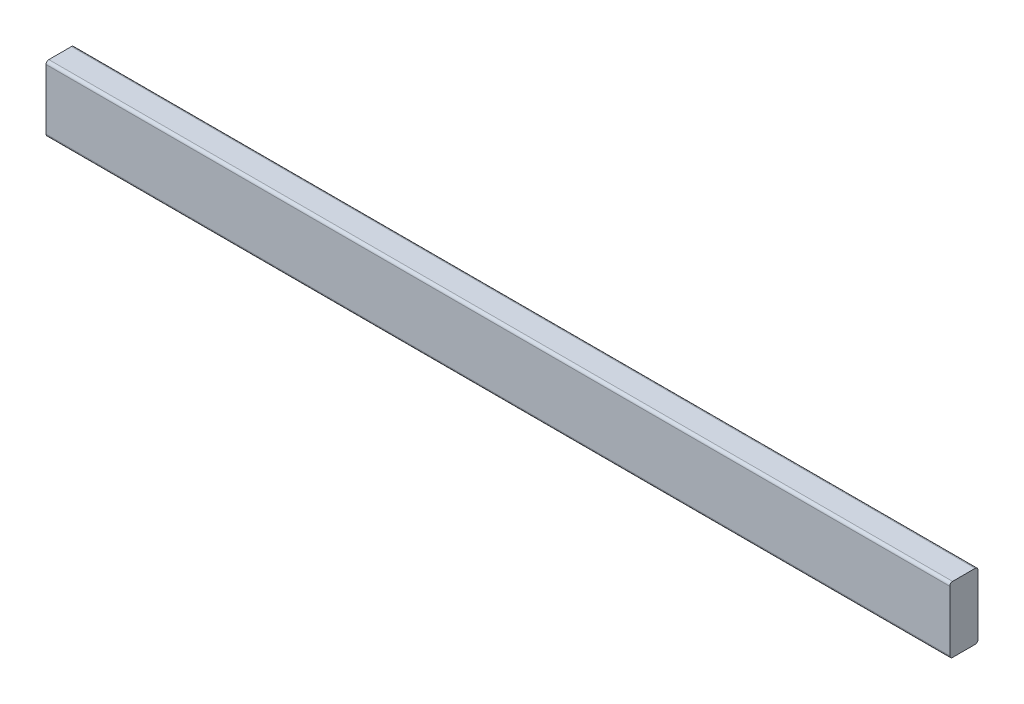
ISO-10303-21;
HEADER;
FILE_DESCRIPTION(('STEP AP214'),'2;1');
FILE_NAME('part.step','',(''),(''),'','','');
FILE_SCHEMA(('AUTOMOTIVE_DESIGN { 1 0 10303 214 1 1 1 1 }'));
ENDSEC;
DATA;
#1=APPLICATION_CONTEXT('core data for automotive mechanical design processes');
#2=APPLICATION_PROTOCOL_DEFINITION('international standard','automotive_design',2000,#1);
#3=PRODUCT_CONTEXT('',#1,'mechanical');
#4=PRODUCT('Part','Part','',(#3));
#5=PRODUCT_RELATED_PRODUCT_CATEGORY('part','',(#4));
#6=PRODUCT_DEFINITION_FORMATION('','',#4);
#7=PRODUCT_DEFINITION_CONTEXT('part definition',#1,'design');
#8=PRODUCT_DEFINITION('design','',#6,#7);
#9=PRODUCT_DEFINITION_SHAPE('','',#8);
#10=(LENGTH_UNIT() NAMED_UNIT(*) SI_UNIT(.MILLI.,.METRE.));
#11=(NAMED_UNIT(*) PLANE_ANGLE_UNIT() SI_UNIT($,.RADIAN.));
#12=(NAMED_UNIT(*) SI_UNIT($,.STERADIAN.) SOLID_ANGLE_UNIT());
#13=UNCERTAINTY_MEASURE_WITH_UNIT(LENGTH_MEASURE(1.E-05),#10,'distance_accuracy_value','');
#14=(GEOMETRIC_REPRESENTATION_CONTEXT(3) GLOBAL_UNCERTAINTY_ASSIGNED_CONTEXT((#13)) GLOBAL_UNIT_ASSIGNED_CONTEXT((#10,
#11,#12)) REPRESENTATION_CONTEXT('',''));
#15=CARTESIAN_POINT('',(0.,0.,0.));
#16=DIRECTION('',(0.,0.,1.));
#17=DIRECTION('',(1.,0.,0.));
#18=AXIS2_PLACEMENT_3D('',#15,#16,#17);
#19=CARTESIAN_POINT('',(609.6,40.64,-15.24));
#20=DIRECTION('',(-1.,0.,0.));
#21=DIRECTION('',(0.,0.,1.));
#22=AXIS2_PLACEMENT_3D('',#19,#20,#21);
#23=CYLINDRICAL_SURFACE('',#22,3.81);
#24=CARTESIAN_POINT('',(-609.6,40.64,-15.24));
#25=DIRECTION('',(1.,0.,0.));
#26=DIRECTION('',(0.,0.,1.));
#27=AXIS2_PLACEMENT_3D('',#24,#25,#26);
#28=CIRCLE('',#27,3.81);
#29=CARTESIAN_POINT('',(-609.6,40.64,-19.05));
#30=VERTEX_POINT('',#29);
#31=CARTESIAN_POINT('',(-609.6,44.45,-15.24));
#32=VERTEX_POINT('',#31);
#33=EDGE_CURVE('E129',#30,#32,#28,.T.);
#34=ORIENTED_EDGE('',*,*,#33,.T.);
#35=DIRECTION('',(-1.,0.,0.));
#36=VECTOR('',#35,1.);
#37=CARTESIAN_POINT('',(609.6,44.45,-15.24));
#38=LINE('',#37,#36);
#39=CARTESIAN_POINT('',(609.6,44.45,-15.24));
#40=VERTEX_POINT('',#39);
#41=EDGE_CURVE('E11',#40,#32,#38,.T.);
#42=ORIENTED_EDGE('',*,*,#41,.F.);
#43=CARTESIAN_POINT('',(609.6,40.64,-15.24));
#44=DIRECTION('',(1.,0.,0.));
#45=DIRECTION('',(0.,0.,1.));
#46=AXIS2_PLACEMENT_3D('',#43,#44,#45);
#47=CIRCLE('',#46,3.81);
#48=CARTESIAN_POINT('',(609.6,40.64,-19.05));
#49=VERTEX_POINT('',#48);
#50=EDGE_CURVE('E143',#49,#40,#47,.T.);
#51=ORIENTED_EDGE('',*,*,#50,.F.);
#52=DIRECTION('',(-1.,0.,0.));
#53=VECTOR('',#52,1.);
#54=CARTESIAN_POINT('',(609.6,40.64,-19.05));
#55=LINE('',#54,#53);
#56=EDGE_CURVE('E125',#49,#30,#55,.T.);
#57=ORIENTED_EDGE('',*,*,#56,.T.);
#58=EDGE_LOOP('',(#34,#42,#51,#57));
#59=FACE_BOUND('',#58,.T.);
#60=ADVANCED_FACE('F33',(#59),#23,.T.);
#61=CARTESIAN_POINT('',(609.6,44.45,15.24));
#62=DIRECTION('',(0.,-1.,0.));
#63=DIRECTION('',(0.,0.,-1.));
#64=AXIS2_PLACEMENT_3D('',#61,#62,#63);
#65=PLANE('',#64);
#66=DIRECTION('',(0.,0.,1.));
#67=VECTOR('',#66,1.);
#68=CARTESIAN_POINT('',(-609.6,44.45,15.24));
#69=LINE('',#68,#67);
#70=CARTESIAN_POINT('',(-609.6,44.45,15.24));
#71=VERTEX_POINT('',#70);
#72=EDGE_CURVE('E132',#32,#71,#69,.T.);
#73=ORIENTED_EDGE('',*,*,#72,.T.);
#74=DIRECTION('',(-1.,0.,0.));
#75=VECTOR('',#74,1.);
#76=CARTESIAN_POINT('',(609.6,44.45,15.24));
#77=LINE('',#76,#75);
#78=CARTESIAN_POINT('',(609.6,44.45,15.24));
#79=VERTEX_POINT('',#78);
#80=EDGE_CURVE('E41',#79,#71,#77,.T.);
#81=ORIENTED_EDGE('',*,*,#80,.F.);
#82=DIRECTION('',(0.,0.,1.));
#83=VECTOR('',#82,1.);
#84=CARTESIAN_POINT('',(609.6,44.45,15.24));
#85=LINE('',#84,#83);
#86=EDGE_CURVE('E92',#40,#79,#85,.T.);
#87=ORIENTED_EDGE('',*,*,#86,.F.);
#88=ORIENTED_EDGE('',*,*,#41,.T.);
#89=EDGE_LOOP('',(#73,#81,#87,#88));
#90=FACE_BOUND('',#89,.T.);
#91=ADVANCED_FACE('F178',(#90),#65,.F.);
#92=CARTESIAN_POINT('',(609.6,40.64,15.24));
#93=DIRECTION('',(-1.,0.,0.));
#94=DIRECTION('',(0.,0.,1.));
#95=AXIS2_PLACEMENT_3D('',#92,#93,#94);
#96=CYLINDRICAL_SURFACE('',#95,3.81);
#97=CARTESIAN_POINT('',(-609.6,40.64,15.24));
#98=DIRECTION('',(1.,0.,0.));
#99=DIRECTION('',(0.,0.,-1.));
#100=AXIS2_PLACEMENT_3D('',#97,#98,#99);
#101=CIRCLE('',#100,3.81);
#102=CARTESIAN_POINT('',(-609.6,40.64,19.05));
#103=VERTEX_POINT('',#102);
#104=EDGE_CURVE('E134',#71,#103,#101,.T.);
#105=ORIENTED_EDGE('',*,*,#104,.T.);
#106=DIRECTION('',(-1.,0.,0.));
#107=VECTOR('',#106,1.);
#108=CARTESIAN_POINT('',(609.6,40.64,19.05));
#109=LINE('',#108,#107);
#110=CARTESIAN_POINT('',(609.6,40.64,19.05));
#111=VERTEX_POINT('',#110);
#112=EDGE_CURVE('E150',#111,#103,#109,.T.);
#113=ORIENTED_EDGE('',*,*,#112,.F.);
#114=CARTESIAN_POINT('',(609.6,40.64,15.24));
#115=DIRECTION('',(1.,0.,0.));
#116=DIRECTION('',(0.,0.,-1.));
#117=AXIS2_PLACEMENT_3D('',#114,#115,#116);
#118=CIRCLE('',#117,3.81);
#119=EDGE_CURVE('E158',#79,#111,#118,.T.);
#120=ORIENTED_EDGE('',*,*,#119,.F.);
#121=ORIENTED_EDGE('',*,*,#80,.T.);
#122=EDGE_LOOP('',(#105,#113,#120,#121));
#123=FACE_BOUND('',#122,.T.);
#124=ADVANCED_FACE('F156',(#123),#96,.T.);
#125=CARTESIAN_POINT('',(609.6,40.64,19.05));
#126=DIRECTION('',(0.,0.,-1.));
#127=DIRECTION('',(0.,1.,0.));
#128=AXIS2_PLACEMENT_3D('',#125,#126,#127);
#129=PLANE('',#128);
#130=DIRECTION('',(0.,-1.,0.));
#131=VECTOR('',#130,1.);
#132=CARTESIAN_POINT('',(-609.6,40.64,19.05));
#133=LINE('',#132,#131);
#134=CARTESIAN_POINT('',(-609.6,-40.64,19.05));
#135=VERTEX_POINT('',#134);
#136=EDGE_CURVE('E136',#103,#135,#133,.T.);
#137=ORIENTED_EDGE('',*,*,#136,.T.);
#138=DIRECTION('',(-1.,0.,0.));
#139=VECTOR('',#138,1.);
#140=CARTESIAN_POINT('',(609.6,-40.64,19.05));
#141=LINE('',#140,#139);
#142=CARTESIAN_POINT('',(609.6,-40.64,19.05));
#143=VERTEX_POINT('',#142);
#144=EDGE_CURVE('E147',#143,#135,#141,.T.);
#145=ORIENTED_EDGE('',*,*,#144,.F.);
#146=DIRECTION('',(0.,-1.,0.));
#147=VECTOR('',#146,1.);
#148=CARTESIAN_POINT('',(609.6,40.64,19.05));
#149=LINE('',#148,#147);
#150=EDGE_CURVE('E170',#111,#143,#149,.T.);
#151=ORIENTED_EDGE('',*,*,#150,.F.);
#152=ORIENTED_EDGE('',*,*,#112,.T.);
#153=EDGE_LOOP('',(#137,#145,#151,#152));
#154=FACE_BOUND('',#153,.T.);
#155=ADVANCED_FACE('F166',(#154),#129,.F.);
#156=CARTESIAN_POINT('',(609.6,-40.64,15.24));
#157=DIRECTION('',(-1.,0.,0.));
#158=DIRECTION('',(0.,0.,1.));
#159=AXIS2_PLACEMENT_3D('',#156,#157,#158);
#160=CYLINDRICAL_SURFACE('',#159,3.81);
#161=CARTESIAN_POINT('',(-609.6,-40.64,15.24));
#162=DIRECTION('',(1.,0.,0.));
#163=DIRECTION('',(0.,0.,-1.));
#164=AXIS2_PLACEMENT_3D('',#161,#162,#163);
#165=CIRCLE('',#164,3.81);
#166=CARTESIAN_POINT('',(-609.6,-44.45,15.24));
#167=VERTEX_POINT('',#166);
#168=EDGE_CURVE('E138',#135,#167,#165,.T.);
#169=ORIENTED_EDGE('',*,*,#168,.T.);
#170=DIRECTION('',(-1.,0.,0.));
#171=VECTOR('',#170,1.);
#172=CARTESIAN_POINT('',(609.6,-44.45,15.24));
#173=LINE('',#172,#171);
#174=CARTESIAN_POINT('',(609.6,-44.45,15.24));
#175=VERTEX_POINT('',#174);
#176=EDGE_CURVE('E120',#175,#167,#173,.T.);
#177=ORIENTED_EDGE('',*,*,#176,.F.);
#178=CARTESIAN_POINT('',(609.6,-40.64,15.24));
#179=DIRECTION('',(1.,0.,0.));
#180=DIRECTION('',(0.,0.,-1.));
#181=AXIS2_PLACEMENT_3D('',#178,#179,#180);
#182=CIRCLE('',#181,3.81);
#183=EDGE_CURVE('E111',#143,#175,#182,.T.);
#184=ORIENTED_EDGE('',*,*,#183,.F.);
#185=ORIENTED_EDGE('',*,*,#144,.T.);
#186=EDGE_LOOP('',(#169,#177,#184,#185));
#187=FACE_BOUND('',#186,.T.);
#188=ADVANCED_FACE('F169',(#187),#160,.T.);
#189=CARTESIAN_POINT('',(609.6,-44.45,15.24));
#190=DIRECTION('',(0.,1.,0.));
#191=DIRECTION('',(0.,0.,1.));
#192=AXIS2_PLACEMENT_3D('',#189,#190,#191);
#193=PLANE('',#192);
#194=DIRECTION('',(0.,0.,-1.));
#195=VECTOR('',#194,1.);
#196=CARTESIAN_POINT('',(-609.6,-44.45,15.24));
#197=LINE('',#196,#195);
#198=CARTESIAN_POINT('',(-609.6,-44.45,-15.24));
#199=VERTEX_POINT('',#198);
#200=EDGE_CURVE('E119',#167,#199,#197,.T.);
#201=ORIENTED_EDGE('',*,*,#200,.T.);
#202=DIRECTION('',(-1.,0.,0.));
#203=VECTOR('',#202,1.);
#204=CARTESIAN_POINT('',(609.6,-44.45,-15.24));
#205=LINE('',#204,#203);
#206=CARTESIAN_POINT('',(609.6,-44.45,-15.24));
#207=VERTEX_POINT('',#206);
#208=EDGE_CURVE('E116',#207,#199,#205,.T.);
#209=ORIENTED_EDGE('',*,*,#208,.F.);
#210=DIRECTION('',(0.,0.,-1.));
#211=VECTOR('',#210,1.);
#212=CARTESIAN_POINT('',(609.6,-44.45,15.24));
#213=LINE('',#212,#211);
#214=EDGE_CURVE('E105',#175,#207,#213,.T.);
#215=ORIENTED_EDGE('',*,*,#214,.F.);
#216=ORIENTED_EDGE('',*,*,#176,.T.);
#217=EDGE_LOOP('',(#201,#209,#215,#216));
#218=FACE_BOUND('',#217,.T.);
#219=ADVANCED_FACE('F117',(#218),#193,.F.);
#220=CARTESIAN_POINT('',(609.6,-40.64,-15.24));
#221=DIRECTION('',(-1.,0.,0.));
#222=DIRECTION('',(0.,0.,1.));
#223=AXIS2_PLACEMENT_3D('',#220,#221,#222);
#224=CYLINDRICAL_SURFACE('',#223,3.81);
#225=CARTESIAN_POINT('',(-609.6,-40.64,-15.24));
#226=DIRECTION('',(1.,0.,0.));
#227=DIRECTION('',(0.,0.,-1.));
#228=AXIS2_PLACEMENT_3D('',#225,#226,#227);
#229=CIRCLE('',#228,3.81);
#230=CARTESIAN_POINT('',(-609.6,-40.64,-19.05));
#231=VERTEX_POINT('',#230);
#232=EDGE_CURVE('E78',#199,#231,#229,.T.);
#233=ORIENTED_EDGE('',*,*,#232,.T.);
#234=DIRECTION('',(-1.,0.,0.));
#235=VECTOR('',#234,1.);
#236=CARTESIAN_POINT('',(609.6,-40.64,-19.05));
#237=LINE('',#236,#235);
#238=CARTESIAN_POINT('',(609.6,-40.64,-19.05));
#239=VERTEX_POINT('',#238);
#240=EDGE_CURVE('E121',#239,#231,#237,.T.);
#241=ORIENTED_EDGE('',*,*,#240,.F.);
#242=CARTESIAN_POINT('',(609.6,-40.64,-15.24));
#243=DIRECTION('',(1.,0.,0.));
#244=DIRECTION('',(0.,0.,-1.));
#245=AXIS2_PLACEMENT_3D('',#242,#243,#244);
#246=CIRCLE('',#245,3.81);
#247=EDGE_CURVE('E109',#207,#239,#246,.T.);
#248=ORIENTED_EDGE('',*,*,#247,.F.);
#249=ORIENTED_EDGE('',*,*,#208,.T.);
#250=EDGE_LOOP('',(#233,#241,#248,#249));
#251=FACE_BOUND('',#250,.T.);
#252=ADVANCED_FACE('F123',(#251),#224,.T.);
#253=CARTESIAN_POINT('',(609.6,40.64,-19.05));
#254=DIRECTION('',(0.,0.,1.));
#255=DIRECTION('',(0.,-1.,0.));
#256=AXIS2_PLACEMENT_3D('',#253,#254,#255);
#257=PLANE('',#256);
#258=DIRECTION('',(0.,1.,0.));
#259=VECTOR('',#258,1.);
#260=CARTESIAN_POINT('',(-609.6,40.64,-19.05));
#261=LINE('',#260,#259);
#262=EDGE_CURVE('E84',#231,#30,#261,.T.);
#263=ORIENTED_EDGE('',*,*,#262,.T.);
#264=ORIENTED_EDGE('',*,*,#56,.F.);
#265=DIRECTION('',(0.,1.,0.));
#266=VECTOR('',#265,1.);
#267=CARTESIAN_POINT('',(609.6,40.64,-19.05));
#268=LINE('',#267,#266);
#269=EDGE_CURVE('E49',#239,#49,#268,.T.);
#270=ORIENTED_EDGE('',*,*,#269,.F.);
#271=ORIENTED_EDGE('',*,*,#240,.T.);
#272=EDGE_LOOP('',(#263,#264,#270,#271));
#273=FACE_BOUND('',#272,.T.);
#274=ADVANCED_FACE('F194',(#273),#257,.F.);
#275=CARTESIAN_POINT('',(609.6,40.64,-15.24));
#276=DIRECTION('',(-1.,0.,0.));
#277=DIRECTION('',(0.,0.,1.));
#278=AXIS2_PLACEMENT_3D('',#275,#276,#277);
#279=PLANE('',#278);
#280=ORIENTED_EDGE('',*,*,#50,.T.);
#281=ORIENTED_EDGE('',*,*,#86,.T.);
#282=ORIENTED_EDGE('',*,*,#119,.T.);
#283=ORIENTED_EDGE('',*,*,#150,.T.);
#284=ORIENTED_EDGE('',*,*,#183,.T.);
#285=ORIENTED_EDGE('',*,*,#214,.T.);
#286=ORIENTED_EDGE('',*,*,#247,.T.);
#287=ORIENTED_EDGE('',*,*,#269,.T.);
#288=EDGE_LOOP('',(#280,#281,#282,#283,#284,#285,#286,#287));
#289=FACE_BOUND('',#288,.T.);
#290=ADVANCED_FACE('F107',(#289),#279,.F.);
#291=CARTESIAN_POINT('',(-609.6,40.64,-15.24));
#292=DIRECTION('',(-1.,0.,0.));
#293=DIRECTION('',(0.,0.,1.));
#294=AXIS2_PLACEMENT_3D('',#291,#292,#293);
#295=PLANE('',#294);
#296=ORIENTED_EDGE('',*,*,#33,.F.);
#297=ORIENTED_EDGE('',*,*,#262,.F.);
#298=ORIENTED_EDGE('',*,*,#232,.F.);
#299=ORIENTED_EDGE('',*,*,#200,.F.);
#300=ORIENTED_EDGE('',*,*,#168,.F.);
#301=ORIENTED_EDGE('',*,*,#136,.F.);
#302=ORIENTED_EDGE('',*,*,#104,.F.);
#303=ORIENTED_EDGE('',*,*,#72,.F.);
#304=EDGE_LOOP('',(#296,#297,#298,#299,#300,#301,#302,#303));
#305=FACE_BOUND('',#304,.T.);
#306=ADVANCED_FACE('F162',(#305),#295,.T.);
#307=CLOSED_SHELL('',(#60,#91,#124,#155,#188,#219,#252,#274,#290,#306));
#308=MANIFOLD_SOLID_BREP('B2',#307);
#309=ADVANCED_BREP_SHAPE_REPRESENTATION('',(#18,#308),#14);
#310=SHAPE_DEFINITION_REPRESENTATION(#9,#309);
ENDSEC;
END-ISO-10303-21;
